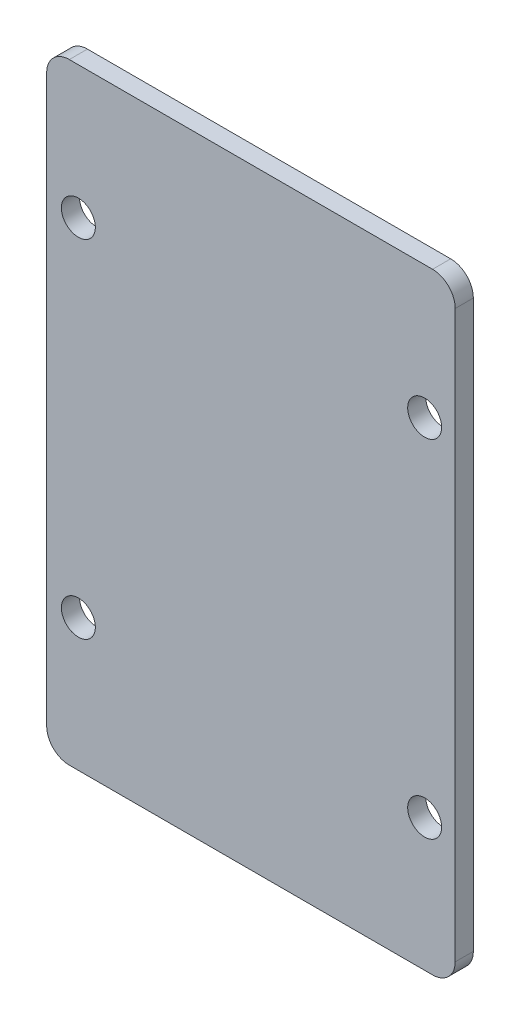
ISO-10303-21;
HEADER;
FILE_DESCRIPTION(('STEP AP214'),'2;1');
FILE_NAME('part.step','',(''),(''),'','','');
FILE_SCHEMA(('AUTOMOTIVE_DESIGN { 1 0 10303 214 1 1 1 1 }'));
ENDSEC;
DATA;
#1=APPLICATION_CONTEXT('core data for automotive mechanical design processes');
#2=APPLICATION_PROTOCOL_DEFINITION('international standard','automotive_design',2000,#1);
#3=PRODUCT_CONTEXT('',#1,'mechanical');
#4=PRODUCT('Part','Part','',(#3));
#5=PRODUCT_RELATED_PRODUCT_CATEGORY('part','',(#4));
#6=PRODUCT_DEFINITION_FORMATION('','',#4);
#7=PRODUCT_DEFINITION_CONTEXT('part definition',#1,'design');
#8=PRODUCT_DEFINITION('design','',#6,#7);
#9=PRODUCT_DEFINITION_SHAPE('','',#8);
#10=(LENGTH_UNIT() NAMED_UNIT(*) SI_UNIT(.MILLI.,.METRE.));
#11=(NAMED_UNIT(*) PLANE_ANGLE_UNIT() SI_UNIT($,.RADIAN.));
#12=(NAMED_UNIT(*) SI_UNIT($,.STERADIAN.) SOLID_ANGLE_UNIT());
#13=UNCERTAINTY_MEASURE_WITH_UNIT(LENGTH_MEASURE(1.E-05),#10,'distance_accuracy_value','');
#14=(GEOMETRIC_REPRESENTATION_CONTEXT(3) GLOBAL_UNCERTAINTY_ASSIGNED_CONTEXT((#13)) GLOBAL_UNIT_ASSIGNED_CONTEXT((#10,
#11,#12)) REPRESENTATION_CONTEXT('',''));
#15=CARTESIAN_POINT('',(0.,0.,0.));
#16=DIRECTION('',(0.,0.,1.));
#17=DIRECTION('',(1.,0.,0.));
#18=AXIS2_PLACEMENT_3D('',#15,#16,#17);
#19=CARTESIAN_POINT('',(85.8080540400462,2.,0.8));
#20=DIRECTION('',(0.,0.,1.));
#21=DIRECTION('',(1.,0.,0.));
#22=AXIS2_PLACEMENT_3D('',#19,#20,#21);
#23=PLANE('',#22);
#24=CARTESIAN_POINT('',(54.5080540400462,42.3,0.8));
#25=DIRECTION('',(0.,0.,1.));
#26=DIRECTION('',(1.,0.,0.));
#27=AXIS2_PLACEMENT_3D('',#24,#25,#26);
#28=CIRCLE('',#27,1.5);
#29=CARTESIAN_POINT('',(56.0080540400462,42.3,0.8));
#30=VERTEX_POINT('',#29);
#31=EDGE_CURVE('E191',#30,#30,#28,.T.);
#32=ORIENTED_EDGE('',*,*,#31,.F.);
#33=EDGE_LOOP('',(#32));
#34=FACE_BOUND('',#33,.T.);
#35=CARTESIAN_POINT('',(85.1080540400462,11.7,0.8));
#36=DIRECTION('',(0.,0.,1.));
#37=DIRECTION('',(1.,0.,0.));
#38=AXIS2_PLACEMENT_3D('',#35,#36,#37);
#39=CIRCLE('',#38,1.5);
#40=CARTESIAN_POINT('',(86.6080540400462,11.7,0.8));
#41=VERTEX_POINT('',#40);
#42=EDGE_CURVE('E137',#41,#41,#39,.T.);
#43=ORIENTED_EDGE('',*,*,#42,.F.);
#44=EDGE_LOOP('',(#43));
#45=FACE_BOUND('',#44,.T.);
#46=CARTESIAN_POINT('',(85.8080540400462,2.,0.8));
#47=DIRECTION('',(0.,0.,1.));
#48=DIRECTION('',(1.,0.,0.));
#49=AXIS2_PLACEMENT_3D('',#46,#47,#48);
#50=CIRCLE('',#49,2.);
#51=CARTESIAN_POINT('',(85.8080540400462,0.,0.8));
#52=VERTEX_POINT('',#51);
#53=CARTESIAN_POINT('',(87.8080540400462,2.,0.8));
#54=VERTEX_POINT('',#53);
#55=EDGE_CURVE('E148',#52,#54,#50,.T.);
#56=ORIENTED_EDGE('',*,*,#55,.T.);
#57=DIRECTION('',(0.,1.,0.));
#58=VECTOR('',#57,1.);
#59=CARTESIAN_POINT('',(87.8080540400462,2.,0.8));
#60=LINE('',#59,#58);
#61=CARTESIAN_POINT('',(87.8080540400462,52.,0.8));
#62=VERTEX_POINT('',#61);
#63=EDGE_CURVE('E96',#54,#62,#60,.T.);
#64=ORIENTED_EDGE('',*,*,#63,.T.);
#65=CARTESIAN_POINT('',(85.8080540400462,52.,0.8));
#66=DIRECTION('',(0.,0.,1.));
#67=DIRECTION('',(1.,0.,0.));
#68=AXIS2_PLACEMENT_3D('',#65,#66,#67);
#69=CIRCLE('',#68,2.);
#70=CARTESIAN_POINT('',(85.8080540400462,54.,0.8));
#71=VERTEX_POINT('',#70);
#72=EDGE_CURVE('E163',#62,#71,#69,.T.);
#73=ORIENTED_EDGE('',*,*,#72,.T.);
#74=DIRECTION('',(-1.,0.,0.));
#75=VECTOR('',#74,1.);
#76=CARTESIAN_POINT('',(85.8080540400462,54.,0.8));
#77=LINE('',#76,#75);
#78=CARTESIAN_POINT('',(53.7080540400462,54.,0.8));
#79=VERTEX_POINT('',#78);
#80=EDGE_CURVE('E176',#71,#79,#77,.T.);
#81=ORIENTED_EDGE('',*,*,#80,.T.);
#82=CARTESIAN_POINT('',(53.7080540400462,52.,0.8));
#83=DIRECTION('',(0.,0.,1.));
#84=DIRECTION('',(1.,0.,0.));
#85=AXIS2_PLACEMENT_3D('',#82,#83,#84);
#86=CIRCLE('',#85,2.);
#87=CARTESIAN_POINT('',(51.7080540400462,52.,0.8));
#88=VERTEX_POINT('',#87);
#89=EDGE_CURVE('E115',#79,#88,#86,.T.);
#90=ORIENTED_EDGE('',*,*,#89,.T.);
#91=DIRECTION('',(0.,-1.,0.));
#92=VECTOR('',#91,1.);
#93=CARTESIAN_POINT('',(51.7080540400462,52.,0.8));
#94=LINE('',#93,#92);
#95=CARTESIAN_POINT('',(51.7080540400462,2.,0.8));
#96=VERTEX_POINT('',#95);
#97=EDGE_CURVE('E109',#88,#96,#94,.T.);
#98=ORIENTED_EDGE('',*,*,#97,.T.);
#99=CARTESIAN_POINT('',(53.7080540400462,2.,0.8));
#100=DIRECTION('',(0.,0.,1.));
#101=DIRECTION('',(1.,0.,0.));
#102=AXIS2_PLACEMENT_3D('',#99,#100,#101);
#103=CIRCLE('',#102,2.);
#104=CARTESIAN_POINT('',(53.7080540400462,0.,0.8));
#105=VERTEX_POINT('',#104);
#106=EDGE_CURVE('E113',#96,#105,#103,.T.);
#107=ORIENTED_EDGE('',*,*,#106,.T.);
#108=DIRECTION('',(1.,0.,0.));
#109=VECTOR('',#108,1.);
#110=CARTESIAN_POINT('',(53.7080540400462,0.,0.8));
#111=LINE('',#110,#109);
#112=EDGE_CURVE('E53',#105,#52,#111,.T.);
#113=ORIENTED_EDGE('',*,*,#112,.T.);
#114=EDGE_LOOP('',(#56,#64,#73,#81,#90,#98,#107,#113));
#115=FACE_BOUND('',#114,.T.);
#116=CARTESIAN_POINT('',(85.1080540400462,42.3,0.8));
#117=DIRECTION('',(0.,0.,1.));
#118=DIRECTION('',(1.,0.,0.));
#119=AXIS2_PLACEMENT_3D('',#116,#117,#118);
#120=CIRCLE('',#119,1.5);
#121=CARTESIAN_POINT('',(86.6080540400462,42.3,0.8));
#122=VERTEX_POINT('',#121);
#123=EDGE_CURVE('E185',#122,#122,#120,.T.);
#124=ORIENTED_EDGE('',*,*,#123,.F.);
#125=EDGE_LOOP('',(#124));
#126=FACE_BOUND('',#125,.T.);
#127=CARTESIAN_POINT('',(54.5080540400462,11.7,0.8));
#128=DIRECTION('',(0.,0.,1.));
#129=DIRECTION('',(1.,0.,0.));
#130=AXIS2_PLACEMENT_3D('',#127,#128,#129);
#131=CIRCLE('',#130,1.5);
#132=CARTESIAN_POINT('',(56.0080540400462,11.7,0.8));
#133=VERTEX_POINT('',#132);
#134=EDGE_CURVE('E197',#133,#133,#131,.T.);
#135=ORIENTED_EDGE('',*,*,#134,.F.);
#136=EDGE_LOOP('',(#135));
#137=FACE_BOUND('',#136,.T.);
#138=ADVANCED_FACE('F36',(#34,#45,#115,#126,#137),#23,.T.);
#139=CARTESIAN_POINT('',(85.8080540400462,2.,-0.8));
#140=DIRECTION('',(0.,0.,1.));
#141=DIRECTION('',(1.,0.,0.));
#142=AXIS2_PLACEMENT_3D('',#139,#140,#141);
#143=PLANE('',#142);
#144=CARTESIAN_POINT('',(85.8080540400462,2.,-0.8));
#145=DIRECTION('',(0.,0.,1.));
#146=DIRECTION('',(1.,0.,0.));
#147=AXIS2_PLACEMENT_3D('',#144,#145,#146);
#148=CIRCLE('',#147,2.);
#149=CARTESIAN_POINT('',(85.8080540400462,0.,-0.8));
#150=VERTEX_POINT('',#149);
#151=CARTESIAN_POINT('',(87.8080540400462,2.,-0.8));
#152=VERTEX_POINT('',#151);
#153=EDGE_CURVE('E133',#150,#152,#148,.T.);
#154=ORIENTED_EDGE('',*,*,#153,.F.);
#155=DIRECTION('',(1.,0.,0.));
#156=VECTOR('',#155,1.);
#157=CARTESIAN_POINT('',(53.7080540400462,0.,-0.8));
#158=LINE('',#157,#156);
#159=CARTESIAN_POINT('',(53.7080540400462,0.,-0.8));
#160=VERTEX_POINT('',#159);
#161=EDGE_CURVE('E88',#160,#150,#158,.T.);
#162=ORIENTED_EDGE('',*,*,#161,.F.);
#163=CARTESIAN_POINT('',(53.7080540400462,2.,-0.8));
#164=DIRECTION('',(0.,0.,1.));
#165=DIRECTION('',(1.,0.,0.));
#166=AXIS2_PLACEMENT_3D('',#163,#164,#165);
#167=CIRCLE('',#166,2.);
#168=CARTESIAN_POINT('',(51.7080540400462,2.,-0.8));
#169=VERTEX_POINT('',#168);
#170=EDGE_CURVE('E82',#169,#160,#167,.T.);
#171=ORIENTED_EDGE('',*,*,#170,.F.);
#172=DIRECTION('',(0.,-1.,0.));
#173=VECTOR('',#172,1.);
#174=CARTESIAN_POINT('',(51.7080540400462,52.,-0.8));
#175=LINE('',#174,#173);
#176=CARTESIAN_POINT('',(51.7080540400462,52.,-0.8));
#177=VERTEX_POINT('',#176);
#178=EDGE_CURVE('E123',#177,#169,#175,.T.);
#179=ORIENTED_EDGE('',*,*,#178,.F.);
#180=CARTESIAN_POINT('',(53.7080540400462,52.,-0.8));
#181=DIRECTION('',(0.,0.,1.));
#182=DIRECTION('',(1.,0.,0.));
#183=AXIS2_PLACEMENT_3D('',#180,#181,#182);
#184=CIRCLE('',#183,2.);
#185=CARTESIAN_POINT('',(53.7080540400462,54.,-0.8));
#186=VERTEX_POINT('',#185);
#187=EDGE_CURVE('E143',#186,#177,#184,.T.);
#188=ORIENTED_EDGE('',*,*,#187,.F.);
#189=DIRECTION('',(-1.,0.,0.));
#190=VECTOR('',#189,1.);
#191=CARTESIAN_POINT('',(85.8080540400462,54.,-0.8));
#192=LINE('',#191,#190);
#193=CARTESIAN_POINT('',(85.8080540400462,54.,-0.8));
#194=VERTEX_POINT('',#193);
#195=EDGE_CURVE('E141',#194,#186,#192,.T.);
#196=ORIENTED_EDGE('',*,*,#195,.F.);
#197=CARTESIAN_POINT('',(85.8080540400462,52.,-0.8));
#198=DIRECTION('',(0.,0.,1.));
#199=DIRECTION('',(1.,0.,0.));
#200=AXIS2_PLACEMENT_3D('',#197,#198,#199);
#201=CIRCLE('',#200,2.);
#202=CARTESIAN_POINT('',(87.8080540400462,52.,-0.8));
#203=VERTEX_POINT('',#202);
#204=EDGE_CURVE('E139',#203,#194,#201,.T.);
#205=ORIENTED_EDGE('',*,*,#204,.F.);
#206=DIRECTION('',(0.,1.,0.));
#207=VECTOR('',#206,1.);
#208=CARTESIAN_POINT('',(87.8080540400462,2.,-0.8));
#209=LINE('',#208,#207);
#210=EDGE_CURVE('E136',#152,#203,#209,.T.);
#211=ORIENTED_EDGE('',*,*,#210,.F.);
#212=EDGE_LOOP('',(#154,#162,#171,#179,#188,#196,#205,#211));
#213=FACE_BOUND('',#212,.T.);
#214=CARTESIAN_POINT('',(85.1080540400462,11.7,-0.8));
#215=DIRECTION('',(0.,0.,1.));
#216=DIRECTION('',(1.,0.,0.));
#217=AXIS2_PLACEMENT_3D('',#214,#215,#216);
#218=CIRCLE('',#217,1.5);
#219=CARTESIAN_POINT('',(86.6080540400462,11.7,-0.8));
#220=VERTEX_POINT('',#219);
#221=EDGE_CURVE('E182',#220,#220,#218,.T.);
#222=ORIENTED_EDGE('',*,*,#221,.T.);
#223=EDGE_LOOP('',(#222));
#224=FACE_BOUND('',#223,.T.);
#225=CARTESIAN_POINT('',(85.1080540400462,42.3,-0.8));
#226=DIRECTION('',(0.,0.,1.));
#227=DIRECTION('',(1.,0.,0.));
#228=AXIS2_PLACEMENT_3D('',#225,#226,#227);
#229=CIRCLE('',#228,1.5);
#230=CARTESIAN_POINT('',(86.6080540400462,42.3,-0.8));
#231=VERTEX_POINT('',#230);
#232=EDGE_CURVE('E188',#231,#231,#229,.T.);
#233=ORIENTED_EDGE('',*,*,#232,.T.);
#234=EDGE_LOOP('',(#233));
#235=FACE_BOUND('',#234,.T.);
#236=CARTESIAN_POINT('',(54.5080540400462,42.3,-0.8));
#237=DIRECTION('',(0.,0.,1.));
#238=DIRECTION('',(1.,0.,0.));
#239=AXIS2_PLACEMENT_3D('',#236,#237,#238);
#240=CIRCLE('',#239,1.5);
#241=CARTESIAN_POINT('',(56.0080540400462,42.3,-0.8));
#242=VERTEX_POINT('',#241);
#243=EDGE_CURVE('E194',#242,#242,#240,.T.);
#244=ORIENTED_EDGE('',*,*,#243,.T.);
#245=EDGE_LOOP('',(#244));
#246=FACE_BOUND('',#245,.T.);
#247=CARTESIAN_POINT('',(54.5080540400462,11.7,-0.8));
#248=DIRECTION('',(0.,0.,1.));
#249=DIRECTION('',(1.,0.,0.));
#250=AXIS2_PLACEMENT_3D('',#247,#248,#249);
#251=CIRCLE('',#250,1.5);
#252=CARTESIAN_POINT('',(56.0080540400462,11.7,-0.8));
#253=VERTEX_POINT('',#252);
#254=EDGE_CURVE('E200',#253,#253,#251,.T.);
#255=ORIENTED_EDGE('',*,*,#254,.T.);
#256=EDGE_LOOP('',(#255));
#257=FACE_BOUND('',#256,.T.);
#258=ADVANCED_FACE('F167',(#213,#224,#235,#246,#257),#143,.F.);
#259=CARTESIAN_POINT('',(85.8080540400462,2.,0.8));
#260=DIRECTION('',(0.,0.,-1.));
#261=DIRECTION('',(-1.,0.,0.));
#262=AXIS2_PLACEMENT_3D('',#259,#260,#261);
#263=CYLINDRICAL_SURFACE('',#262,2.);
#264=ORIENTED_EDGE('',*,*,#153,.T.);
#265=DIRECTION('',(0.,0.,-1.));
#266=VECTOR('',#265,1.);
#267=CARTESIAN_POINT('',(87.8080540400462,2.,0.8));
#268=LINE('',#267,#266);
#269=EDGE_CURVE('E11',#54,#152,#268,.T.);
#270=ORIENTED_EDGE('',*,*,#269,.F.);
#271=ORIENTED_EDGE('',*,*,#55,.F.);
#272=DIRECTION('',(0.,0.,-1.));
#273=VECTOR('',#272,1.);
#274=CARTESIAN_POINT('',(85.8080540400462,0.,0.8));
#275=LINE('',#274,#273);
#276=EDGE_CURVE('E129',#52,#150,#275,.T.);
#277=ORIENTED_EDGE('',*,*,#276,.T.);
#278=EDGE_LOOP('',(#264,#270,#271,#277));
#279=FACE_BOUND('',#278,.T.);
#280=ADVANCED_FACE('F38',(#279),#263,.T.);
#281=CARTESIAN_POINT('',(87.8080540400462,2.,0.8));
#282=DIRECTION('',(-1.,0.,0.));
#283=DIRECTION('',(0.,0.,1.));
#284=AXIS2_PLACEMENT_3D('',#281,#282,#283);
#285=PLANE('',#284);
#286=ORIENTED_EDGE('',*,*,#210,.T.);
#287=DIRECTION('',(0.,0.,-1.));
#288=VECTOR('',#287,1.);
#289=CARTESIAN_POINT('',(87.8080540400462,52.,0.8));
#290=LINE('',#289,#288);
#291=EDGE_CURVE('E45',#62,#203,#290,.T.);
#292=ORIENTED_EDGE('',*,*,#291,.F.);
#293=ORIENTED_EDGE('',*,*,#63,.F.);
#294=ORIENTED_EDGE('',*,*,#269,.T.);
#295=EDGE_LOOP('',(#286,#292,#293,#294));
#296=FACE_BOUND('',#295,.T.);
#297=ADVANCED_FACE('F234',(#296),#285,.F.);
#298=CARTESIAN_POINT('',(85.8080540400462,52.,0.8));
#299=DIRECTION('',(0.,0.,-1.));
#300=DIRECTION('',(-1.,0.,0.));
#301=AXIS2_PLACEMENT_3D('',#298,#299,#300);
#302=CYLINDRICAL_SURFACE('',#301,2.);
#303=ORIENTED_EDGE('',*,*,#204,.T.);
#304=DIRECTION('',(0.,0.,-1.));
#305=VECTOR('',#304,1.);
#306=CARTESIAN_POINT('',(85.8080540400462,54.,0.8));
#307=LINE('',#306,#305);
#308=EDGE_CURVE('E155',#71,#194,#307,.T.);
#309=ORIENTED_EDGE('',*,*,#308,.F.);
#310=ORIENTED_EDGE('',*,*,#72,.F.);
#311=ORIENTED_EDGE('',*,*,#291,.T.);
#312=EDGE_LOOP('',(#303,#309,#310,#311));
#313=FACE_BOUND('',#312,.T.);
#314=ADVANCED_FACE('F161',(#313),#302,.T.);
#315=CARTESIAN_POINT('',(85.8080540400462,54.,0.8));
#316=DIRECTION('',(0.,-1.,0.));
#317=DIRECTION('',(0.,0.,-1.));
#318=AXIS2_PLACEMENT_3D('',#315,#316,#317);
#319=PLANE('',#318);
#320=ORIENTED_EDGE('',*,*,#195,.T.);
#321=DIRECTION('',(0.,0.,-1.));
#322=VECTOR('',#321,1.);
#323=CARTESIAN_POINT('',(53.7080540400462,54.,0.8));
#324=LINE('',#323,#322);
#325=EDGE_CURVE('E152',#79,#186,#324,.T.);
#326=ORIENTED_EDGE('',*,*,#325,.F.);
#327=ORIENTED_EDGE('',*,*,#80,.F.);
#328=ORIENTED_EDGE('',*,*,#308,.T.);
#329=EDGE_LOOP('',(#320,#326,#327,#328));
#330=FACE_BOUND('',#329,.T.);
#331=ADVANCED_FACE('F172',(#330),#319,.F.);
#332=CARTESIAN_POINT('',(53.7080540400462,52.,0.8));
#333=DIRECTION('',(0.,0.,-1.));
#334=DIRECTION('',(-1.,0.,0.));
#335=AXIS2_PLACEMENT_3D('',#332,#333,#334);
#336=CYLINDRICAL_SURFACE('',#335,2.);
#337=ORIENTED_EDGE('',*,*,#187,.T.);
#338=DIRECTION('',(0.,0.,-1.));
#339=VECTOR('',#338,1.);
#340=CARTESIAN_POINT('',(51.7080540400462,52.,0.8));
#341=LINE('',#340,#339);
#342=EDGE_CURVE('E124',#88,#177,#341,.T.);
#343=ORIENTED_EDGE('',*,*,#342,.F.);
#344=ORIENTED_EDGE('',*,*,#89,.F.);
#345=ORIENTED_EDGE('',*,*,#325,.T.);
#346=EDGE_LOOP('',(#337,#343,#344,#345));
#347=FACE_BOUND('',#346,.T.);
#348=ADVANCED_FACE('F175',(#347),#336,.T.);
#349=CARTESIAN_POINT('',(51.7080540400462,52.,0.8));
#350=DIRECTION('',(1.,0.,0.));
#351=DIRECTION('',(0.,1.,0.));
#352=AXIS2_PLACEMENT_3D('',#349,#350,#351);
#353=PLANE('',#352);
#354=ORIENTED_EDGE('',*,*,#178,.T.);
#355=DIRECTION('',(0.,0.,-1.));
#356=VECTOR('',#355,1.);
#357=CARTESIAN_POINT('',(51.7080540400462,2.,0.8));
#358=LINE('',#357,#356);
#359=EDGE_CURVE('E120',#96,#169,#358,.T.);
#360=ORIENTED_EDGE('',*,*,#359,.F.);
#361=ORIENTED_EDGE('',*,*,#97,.F.);
#362=ORIENTED_EDGE('',*,*,#342,.T.);
#363=EDGE_LOOP('',(#354,#360,#361,#362));
#364=FACE_BOUND('',#363,.T.);
#365=ADVANCED_FACE('F121',(#364),#353,.F.);
#366=CARTESIAN_POINT('',(53.7080540400462,2.,0.8));
#367=DIRECTION('',(0.,0.,-1.));
#368=DIRECTION('',(-1.,0.,0.));
#369=AXIS2_PLACEMENT_3D('',#366,#367,#368);
#370=CYLINDRICAL_SURFACE('',#369,2.);
#371=ORIENTED_EDGE('',*,*,#170,.T.);
#372=DIRECTION('',(0.,0.,-1.));
#373=VECTOR('',#372,1.);
#374=CARTESIAN_POINT('',(53.7080540400462,0.,0.8));
#375=LINE('',#374,#373);
#376=EDGE_CURVE('E125',#105,#160,#375,.T.);
#377=ORIENTED_EDGE('',*,*,#376,.F.);
#378=ORIENTED_EDGE('',*,*,#106,.F.);
#379=ORIENTED_EDGE('',*,*,#359,.T.);
#380=EDGE_LOOP('',(#371,#377,#378,#379));
#381=FACE_BOUND('',#380,.T.);
#382=ADVANCED_FACE('F127',(#381),#370,.T.);
#383=CARTESIAN_POINT('',(53.7080540400462,0.,0.8));
#384=DIRECTION('',(0.,1.,0.));
#385=DIRECTION('',(0.,0.,1.));
#386=AXIS2_PLACEMENT_3D('',#383,#384,#385);
#387=PLANE('',#386);
#388=ORIENTED_EDGE('',*,*,#161,.T.);
#389=ORIENTED_EDGE('',*,*,#276,.F.);
#390=ORIENTED_EDGE('',*,*,#112,.F.);
#391=ORIENTED_EDGE('',*,*,#376,.T.);
#392=EDGE_LOOP('',(#388,#389,#390,#391));
#393=FACE_BOUND('',#392,.T.);
#394=ADVANCED_FACE('F222',(#393),#387,.F.);
#395=CARTESIAN_POINT('',(85.1080540400462,11.7,0.8));
#396=DIRECTION('',(0.,0.,-1.));
#397=DIRECTION('',(-1.,0.,0.));
#398=AXIS2_PLACEMENT_3D('',#395,#396,#397);
#399=CYLINDRICAL_SURFACE('',#398,1.5);
#400=ORIENTED_EDGE('',*,*,#42,.T.);
#401=EDGE_LOOP('',(#400));
#402=FACE_BOUND('',#401,.T.);
#403=ORIENTED_EDGE('',*,*,#221,.F.);
#404=EDGE_LOOP('',(#403));
#405=FACE_BOUND('',#404,.T.);
#406=ADVANCED_FACE('F219',(#402,#405),#399,.F.);
#407=CARTESIAN_POINT('',(85.1080540400462,42.3,0.8));
#408=DIRECTION('',(0.,0.,-1.));
#409=DIRECTION('',(-1.,0.,0.));
#410=AXIS2_PLACEMENT_3D('',#407,#408,#409);
#411=CYLINDRICAL_SURFACE('',#410,1.5);
#412=ORIENTED_EDGE('',*,*,#123,.T.);
#413=EDGE_LOOP('',(#412));
#414=FACE_BOUND('',#413,.T.);
#415=ORIENTED_EDGE('',*,*,#232,.F.);
#416=EDGE_LOOP('',(#415));
#417=FACE_BOUND('',#416,.T.);
#418=ADVANCED_FACE('F298',(#414,#417),#411,.F.);
#419=CARTESIAN_POINT('',(54.5080540400462,42.3,0.8));
#420=DIRECTION('',(0.,0.,-1.));
#421=DIRECTION('',(-1.,0.,0.));
#422=AXIS2_PLACEMENT_3D('',#419,#420,#421);
#423=CYLINDRICAL_SURFACE('',#422,1.5);
#424=ORIENTED_EDGE('',*,*,#31,.T.);
#425=EDGE_LOOP('',(#424));
#426=FACE_BOUND('',#425,.T.);
#427=ORIENTED_EDGE('',*,*,#243,.F.);
#428=EDGE_LOOP('',(#427));
#429=FACE_BOUND('',#428,.T.);
#430=ADVANCED_FACE('F306',(#426,#429),#423,.F.);
#431=CARTESIAN_POINT('',(54.5080540400462,11.7,0.8));
#432=DIRECTION('',(0.,0.,-1.));
#433=DIRECTION('',(-1.,0.,0.));
#434=AXIS2_PLACEMENT_3D('',#431,#432,#433);
#435=CYLINDRICAL_SURFACE('',#434,1.5);
#436=ORIENTED_EDGE('',*,*,#134,.T.);
#437=EDGE_LOOP('',(#436));
#438=FACE_BOUND('',#437,.T.);
#439=ORIENTED_EDGE('',*,*,#254,.F.);
#440=EDGE_LOOP('',(#439));
#441=FACE_BOUND('',#440,.T.);
#442=ADVANCED_FACE('F206',(#438,#441),#435,.F.);
#443=CLOSED_SHELL('',(#138,#258,#280,#297,#314,#331,#348,#365,#382,#394,#406,#418,#430,#442));
#444=MANIFOLD_SOLID_BREP('B2',#443);
#445=ADVANCED_BREP_SHAPE_REPRESENTATION('',(#18,#444),#14);
#446=SHAPE_DEFINITION_REPRESENTATION(#9,#445);
ENDSEC;
END-ISO-10303-21;
